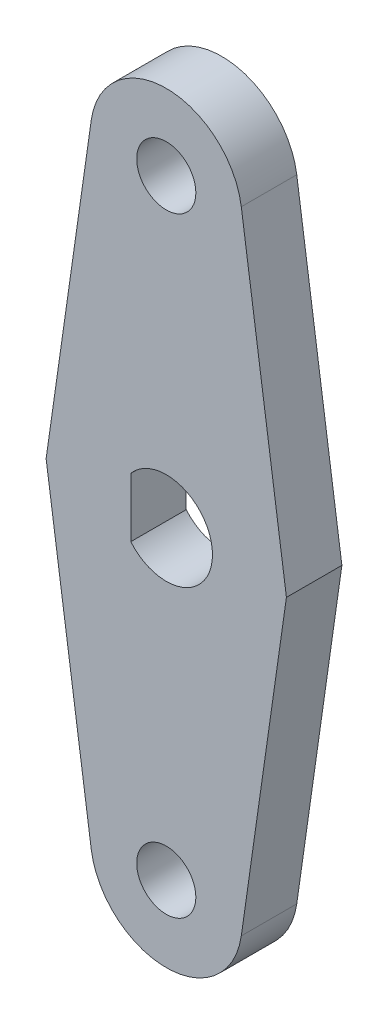
ISO-10303-21;
HEADER;
FILE_DESCRIPTION(('STEP AP214'),'2;1');
FILE_NAME('part.step','',(''),(''),'','','');
FILE_SCHEMA(('AUTOMOTIVE_DESIGN { 1 0 10303 214 1 1 1 1 }'));
ENDSEC;
DATA;
#1=APPLICATION_CONTEXT('core data for automotive mechanical design processes');
#2=APPLICATION_PROTOCOL_DEFINITION('international standard','automotive_design',2000,#1);
#3=PRODUCT_CONTEXT('',#1,'mechanical');
#4=PRODUCT('Part','Part','',(#3));
#5=PRODUCT_RELATED_PRODUCT_CATEGORY('part','',(#4));
#6=PRODUCT_DEFINITION_FORMATION('','',#4);
#7=PRODUCT_DEFINITION_CONTEXT('part definition',#1,'design');
#8=PRODUCT_DEFINITION('design','',#6,#7);
#9=PRODUCT_DEFINITION_SHAPE('','',#8);
#10=(LENGTH_UNIT() NAMED_UNIT(*) SI_UNIT(.MILLI.,.METRE.));
#11=(NAMED_UNIT(*) PLANE_ANGLE_UNIT() SI_UNIT($,.RADIAN.));
#12=(NAMED_UNIT(*) SI_UNIT($,.STERADIAN.) SOLID_ANGLE_UNIT());
#13=UNCERTAINTY_MEASURE_WITH_UNIT(LENGTH_MEASURE(1.E-05),#10,'distance_accuracy_value','');
#14=(GEOMETRIC_REPRESENTATION_CONTEXT(3) GLOBAL_UNCERTAINTY_ASSIGNED_CONTEXT((#13)) GLOBAL_UNIT_ASSIGNED_CONTEXT((#10,
#11,#12)) REPRESENTATION_CONTEXT('',''));
#15=CARTESIAN_POINT('',(0.,0.,0.));
#16=DIRECTION('',(0.,0.,1.));
#17=DIRECTION('',(1.,0.,0.));
#18=AXIS2_PLACEMENT_3D('',#15,#16,#17);
#19=CARTESIAN_POINT('',(0.,0.,3.));
#20=DIRECTION('',(0.,0.,-1.));
#21=DIRECTION('',(-1.,0.,0.));
#22=AXIS2_PLACEMENT_3D('',#19,#20,#21);
#23=CYLINDRICAL_SURFACE('',#22,2.5);
#24=CARTESIAN_POINT('',(0.,0.,0.));
#25=DIRECTION('',(0.,0.,1.));
#26=DIRECTION('',(1.,0.,0.));
#27=AXIS2_PLACEMENT_3D('',#24,#25,#26);
#28=CIRCLE('',#27,2.5);
#29=CARTESIAN_POINT('',(-1.92,-1.60112460477003,0.));
#30=VERTEX_POINT('',#29);
#31=CARTESIAN_POINT('',(-1.92,1.60112460477003,0.));
#32=VERTEX_POINT('',#31);
#33=EDGE_CURVE('E197',#30,#32,#28,.T.);
#34=ORIENTED_EDGE('',*,*,#33,.F.);
#35=DIRECTION('',(0.,0.,-1.));
#36=VECTOR('',#35,1.);
#37=CARTESIAN_POINT('',(-1.92,-1.60112460477003,3.));
#38=LINE('',#37,#36);
#39=CARTESIAN_POINT('',(-1.92,-1.60112460477003,3.));
#40=VERTEX_POINT('',#39);
#41=EDGE_CURVE('E11',#40,#30,#38,.T.);
#42=ORIENTED_EDGE('',*,*,#41,.F.);
#43=CARTESIAN_POINT('',(0.,0.,3.));
#44=DIRECTION('',(0.,0.,1.));
#45=DIRECTION('',(1.,0.,0.));
#46=AXIS2_PLACEMENT_3D('',#43,#44,#45);
#47=CIRCLE('',#46,2.5);
#48=CARTESIAN_POINT('',(-1.92,1.60112460477003,3.));
#49=VERTEX_POINT('',#48);
#50=EDGE_CURVE('E129',#40,#49,#47,.T.);
#51=ORIENTED_EDGE('',*,*,#50,.T.);
#52=DIRECTION('',(0.,0.,-1.));
#53=VECTOR('',#52,1.);
#54=CARTESIAN_POINT('',(-1.92,1.60112460477003,3.));
#55=LINE('',#54,#53);
#56=EDGE_CURVE('E59',#49,#32,#55,.T.);
#57=ORIENTED_EDGE('',*,*,#56,.T.);
#58=EDGE_LOOP('',(#34,#42,#51,#57));
#59=FACE_BOUND('',#58,.T.);
#60=ADVANCED_FACE('F50',(#59),#23,.F.);
#61=CARTESIAN_POINT('',(0.,-16.5,3.));
#62=DIRECTION('',(0.,0.,-1.));
#63=DIRECTION('',(-1.,0.,0.));
#64=AXIS2_PLACEMENT_3D('',#61,#62,#63);
#65=CYLINDRICAL_SURFACE('',#64,4.1);
#66=CARTESIAN_POINT('',(0.,-16.5,0.));
#67=DIRECTION('',(0.,0.,1.));
#68=DIRECTION('',(1.,0.,0.));
#69=AXIS2_PLACEMENT_3D('',#66,#67,#68);
#70=CIRCLE('',#69,4.1);
#71=CARTESIAN_POINT('',(-4.05875193670604,-17.0801143993084,0.));
#72=VERTEX_POINT('',#71);
#73=CARTESIAN_POINT('',(4.05875193670604,-17.0801143993084,0.));
#74=VERTEX_POINT('',#73);
#75=EDGE_CURVE('E176',#72,#74,#70,.T.);
#76=ORIENTED_EDGE('',*,*,#75,.T.);
#77=DIRECTION('',(0.,0.,-1.));
#78=VECTOR('',#77,1.);
#79=CARTESIAN_POINT('',(4.05875193670604,-17.0801143993084,3.));
#80=LINE('',#79,#78);
#81=CARTESIAN_POINT('',(4.05875193670604,-17.0801143993084,3.));
#82=VERTEX_POINT('',#81);
#83=EDGE_CURVE('E51',#82,#74,#80,.T.);
#84=ORIENTED_EDGE('',*,*,#83,.F.);
#85=CARTESIAN_POINT('',(0.,-16.5,3.));
#86=DIRECTION('',(0.,0.,1.));
#87=DIRECTION('',(1.,0.,0.));
#88=AXIS2_PLACEMENT_3D('',#85,#86,#87);
#89=CIRCLE('',#88,4.1);
#90=CARTESIAN_POINT('',(-4.05875193670604,-17.0801143993084,3.));
#91=VERTEX_POINT('',#90);
#92=EDGE_CURVE('E106',#91,#82,#89,.T.);
#93=ORIENTED_EDGE('',*,*,#92,.F.);
#94=DIRECTION('',(0.,0.,-1.));
#95=VECTOR('',#94,1.);
#96=CARTESIAN_POINT('',(-4.05875193670604,-17.0801143993084,3.));
#97=LINE('',#96,#95);
#98=EDGE_CURVE('E135',#91,#72,#97,.T.);
#99=ORIENTED_EDGE('',*,*,#98,.T.);
#100=EDGE_LOOP('',(#76,#84,#93,#99));
#101=FACE_BOUND('',#100,.T.);
#102=ADVANCED_FACE('F142',(#101),#65,.T.);
#103=CARTESIAN_POINT('',(6.3698713470641,-0.910440979838026,3.));
#104=DIRECTION('',(0.98993949675757,-0.141491316904497,0.));
#105=DIRECTION('',(0.141491316904497,0.98993949675757,0.));
#106=AXIS2_PLACEMENT_3D('',#103,#104,#105);
#107=PLANE('',#106);
#108=DIRECTION('',(-0.141491316904497,-0.98993949675757,0.));
#109=VECTOR('',#108,1.);
#110=CARTESIAN_POINT('',(6.3698713470641,-0.910440979838026,0.));
#111=LINE('',#110,#109);
#112=CARTESIAN_POINT('',(6.5,0.,0.));
#113=VERTEX_POINT('',#112);
#114=EDGE_CURVE('E177',#113,#74,#111,.T.);
#115=ORIENTED_EDGE('',*,*,#114,.F.);
#116=DIRECTION('',(0.,0.,-1.));
#117=VECTOR('',#116,1.);
#118=CARTESIAN_POINT('',(6.5,0.,3.));
#119=LINE('',#118,#117);
#120=CARTESIAN_POINT('',(6.5,0.,3.));
#121=VERTEX_POINT('',#120);
#122=EDGE_CURVE('E218',#121,#113,#119,.T.);
#123=ORIENTED_EDGE('',*,*,#122,.F.);
#124=DIRECTION('',(-0.141491316904497,-0.98993949675757,0.));
#125=VECTOR('',#124,1.);
#126=CARTESIAN_POINT('',(6.3698713470641,-0.910440979838026,3.));
#127=LINE('',#126,#125);
#128=EDGE_CURVE('E147',#121,#82,#127,.T.);
#129=ORIENTED_EDGE('',*,*,#128,.T.);
#130=ORIENTED_EDGE('',*,*,#83,.T.);
#131=EDGE_LOOP('',(#115,#123,#129,#130));
#132=FACE_BOUND('',#131,.T.);
#133=ADVANCED_FACE('F222',(#132),#107,.T.);
#134=CARTESIAN_POINT('',(6.3698713470641,0.910440979838026,3.));
#135=DIRECTION('',(-0.98993949675757,-0.141491316904497,0.));
#136=DIRECTION('',(0.141491316904497,-0.98993949675757,0.));
#137=AXIS2_PLACEMENT_3D('',#134,#135,#136);
#138=PLANE('',#137);
#139=DIRECTION('',(-0.141491316904497,0.98993949675757,0.));
#140=VECTOR('',#139,1.);
#141=CARTESIAN_POINT('',(6.3698713470641,0.910440979838026,0.));
#142=LINE('',#141,#140);
#143=CARTESIAN_POINT('',(4.05875193670604,17.0801143993084,0.));
#144=VERTEX_POINT('',#143);
#145=EDGE_CURVE('E183',#113,#144,#142,.T.);
#146=ORIENTED_EDGE('',*,*,#145,.T.);
#147=DIRECTION('',(0.,0.,-1.));
#148=VECTOR('',#147,1.);
#149=CARTESIAN_POINT('',(4.05875193670604,17.0801143993084,3.));
#150=LINE('',#149,#148);
#151=CARTESIAN_POINT('',(4.05875193670604,17.0801143993084,3.));
#152=VERTEX_POINT('',#151);
#153=EDGE_CURVE('E215',#152,#144,#150,.T.);
#154=ORIENTED_EDGE('',*,*,#153,.F.);
#155=DIRECTION('',(-0.141491316904497,0.98993949675757,0.));
#156=VECTOR('',#155,1.);
#157=CARTESIAN_POINT('',(6.3698713470641,0.910440979838026,3.));
#158=LINE('',#157,#156);
#159=EDGE_CURVE('E151',#121,#152,#158,.T.);
#160=ORIENTED_EDGE('',*,*,#159,.F.);
#161=ORIENTED_EDGE('',*,*,#122,.T.);
#162=EDGE_LOOP('',(#146,#154,#160,#161));
#163=FACE_BOUND('',#162,.T.);
#164=ADVANCED_FACE('F229',(#163),#138,.F.);
#165=CARTESIAN_POINT('',(0.,16.5,3.));
#166=DIRECTION('',(0.,0.,-1.));
#167=DIRECTION('',(-1.,0.,0.));
#168=AXIS2_PLACEMENT_3D('',#165,#166,#167);
#169=CYLINDRICAL_SURFACE('',#168,4.1);
#170=CARTESIAN_POINT('',(0.,16.5,0.));
#171=DIRECTION('',(0.,0.,1.));
#172=DIRECTION('',(1.,0.,0.));
#173=AXIS2_PLACEMENT_3D('',#170,#171,#172);
#174=CIRCLE('',#173,4.1);
#175=CARTESIAN_POINT('',(-4.05875193670604,17.0801143993084,0.));
#176=VERTEX_POINT('',#175);
#177=EDGE_CURVE('E190',#176,#144,#174,.F.);
#178=ORIENTED_EDGE('',*,*,#177,.F.);
#179=DIRECTION('',(0.,0.,-1.));
#180=VECTOR('',#179,1.);
#181=CARTESIAN_POINT('',(-4.05875193670604,17.0801143993084,3.));
#182=LINE('',#181,#180);
#183=CARTESIAN_POINT('',(-4.05875193670604,17.0801143993084,3.));
#184=VERTEX_POINT('',#183);
#185=EDGE_CURVE('E213',#184,#176,#182,.T.);
#186=ORIENTED_EDGE('',*,*,#185,.F.);
#187=CARTESIAN_POINT('',(0.,16.5,3.));
#188=DIRECTION('',(0.,0.,1.));
#189=DIRECTION('',(1.,0.,0.));
#190=AXIS2_PLACEMENT_3D('',#187,#188,#189);
#191=CIRCLE('',#190,4.1);
#192=EDGE_CURVE('E159',#184,#152,#191,.F.);
#193=ORIENTED_EDGE('',*,*,#192,.T.);
#194=ORIENTED_EDGE('',*,*,#153,.T.);
#195=EDGE_LOOP('',(#178,#186,#193,#194));
#196=FACE_BOUND('',#195,.T.);
#197=ADVANCED_FACE('F235',(#196),#169,.T.);
#198=CARTESIAN_POINT('',(-6.3698713470641,0.910440979838026,3.));
#199=DIRECTION('',(-0.98993949675757,0.141491316904497,0.));
#200=DIRECTION('',(-0.141491316904497,-0.98993949675757,0.));
#201=AXIS2_PLACEMENT_3D('',#198,#199,#200);
#202=PLANE('',#201);
#203=DIRECTION('',(0.141491316904497,0.98993949675757,0.));
#204=VECTOR('',#203,1.);
#205=CARTESIAN_POINT('',(-6.3698713470641,0.910440979838026,0.));
#206=LINE('',#205,#204);
#207=CARTESIAN_POINT('',(-6.5,0.,0.));
#208=VERTEX_POINT('',#207);
#209=EDGE_CURVE('E192',#208,#176,#206,.T.);
#210=ORIENTED_EDGE('',*,*,#209,.F.);
#211=DIRECTION('',(0.,0.,-1.));
#212=VECTOR('',#211,1.);
#213=CARTESIAN_POINT('',(-6.5,0.,3.));
#214=LINE('',#213,#212);
#215=CARTESIAN_POINT('',(-6.5,0.,3.));
#216=VERTEX_POINT('',#215);
#217=EDGE_CURVE('E139',#216,#208,#214,.T.);
#218=ORIENTED_EDGE('',*,*,#217,.F.);
#219=DIRECTION('',(0.141491316904497,0.98993949675757,0.));
#220=VECTOR('',#219,1.);
#221=CARTESIAN_POINT('',(-6.3698713470641,0.910440979838026,3.));
#222=LINE('',#221,#220);
#223=EDGE_CURVE('E128',#216,#184,#222,.T.);
#224=ORIENTED_EDGE('',*,*,#223,.T.);
#225=ORIENTED_EDGE('',*,*,#185,.T.);
#226=EDGE_LOOP('',(#210,#218,#224,#225));
#227=FACE_BOUND('',#226,.T.);
#228=ADVANCED_FACE('F234',(#227),#202,.T.);
#229=CARTESIAN_POINT('',(-1.92,0.,3.));
#230=DIRECTION('',(-1.,0.,0.));
#231=DIRECTION('',(0.,0.,1.));
#232=AXIS2_PLACEMENT_3D('',#229,#230,#231);
#233=PLANE('',#232);
#234=DIRECTION('',(0.,1.,0.));
#235=VECTOR('',#234,1.);
#236=CARTESIAN_POINT('',(-1.92,0.,0.));
#237=LINE('',#236,#235);
#238=EDGE_CURVE('E202',#30,#32,#237,.T.);
#239=ORIENTED_EDGE('',*,*,#238,.T.);
#240=ORIENTED_EDGE('',*,*,#56,.F.);
#241=DIRECTION('',(0.,1.,0.));
#242=VECTOR('',#241,1.);
#243=CARTESIAN_POINT('',(-1.92,0.,3.));
#244=LINE('',#243,#242);
#245=EDGE_CURVE('E67',#40,#49,#244,.T.);
#246=ORIENTED_EDGE('',*,*,#245,.F.);
#247=ORIENTED_EDGE('',*,*,#41,.T.);
#248=EDGE_LOOP('',(#239,#240,#246,#247));
#249=FACE_BOUND('',#248,.T.);
#250=ADVANCED_FACE('F240',(#249),#233,.F.);
#251=CARTESIAN_POINT('',(-6.3698713470641,-0.910440979838026,3.));
#252=DIRECTION('',(0.98993949675757,0.141491316904497,0.));
#253=DIRECTION('',(-0.141491316904497,0.98993949675757,0.));
#254=AXIS2_PLACEMENT_3D('',#251,#252,#253);
#255=PLANE('',#254);
#256=DIRECTION('',(0.141491316904497,-0.98993949675757,0.));
#257=VECTOR('',#256,1.);
#258=CARTESIAN_POINT('',(-6.3698713470641,-0.910440979838026,0.));
#259=LINE('',#258,#257);
#260=EDGE_CURVE('E134',#208,#72,#259,.T.);
#261=ORIENTED_EDGE('',*,*,#260,.T.);
#262=ORIENTED_EDGE('',*,*,#98,.F.);
#263=DIRECTION('',(0.141491316904497,-0.98993949675757,0.));
#264=VECTOR('',#263,1.);
#265=CARTESIAN_POINT('',(-6.3698713470641,-0.910440979838026,3.));
#266=LINE('',#265,#264);
#267=EDGE_CURVE('E123',#216,#91,#266,.T.);
#268=ORIENTED_EDGE('',*,*,#267,.F.);
#269=ORIENTED_EDGE('',*,*,#217,.T.);
#270=EDGE_LOOP('',(#261,#262,#268,#269));
#271=FACE_BOUND('',#270,.T.);
#272=ADVANCED_FACE('F133',(#271),#255,.F.);
#273=CARTESIAN_POINT('',(0.,-16.5,3.));
#274=DIRECTION('',(0.,0.,-1.));
#275=DIRECTION('',(-1.,0.,0.));
#276=AXIS2_PLACEMENT_3D('',#273,#274,#275);
#277=CYLINDRICAL_SURFACE('',#276,1.6);
#278=CARTESIAN_POINT('',(0.,-16.5,3.));
#279=DIRECTION('',(0.,0.,1.));
#280=DIRECTION('',(1.,0.,0.));
#281=AXIS2_PLACEMENT_3D('',#278,#279,#280);
#282=CIRCLE('',#281,1.6);
#283=CARTESIAN_POINT('',(1.6,-16.5,3.));
#284=VERTEX_POINT('',#283);
#285=EDGE_CURVE('E150',#284,#284,#282,.T.);
#286=ORIENTED_EDGE('',*,*,#285,.T.);
#287=EDGE_LOOP('',(#286));
#288=FACE_BOUND('',#287,.T.);
#289=CARTESIAN_POINT('',(0.,-16.5,0.));
#290=DIRECTION('',(0.,0.,1.));
#291=DIRECTION('',(1.,0.,0.));
#292=AXIS2_PLACEMENT_3D('',#289,#290,#291);
#293=CIRCLE('',#292,1.6);
#294=CARTESIAN_POINT('',(1.6,-16.5,0.));
#295=VERTEX_POINT('',#294);
#296=EDGE_CURVE('E175',#295,#295,#293,.T.);
#297=ORIENTED_EDGE('',*,*,#296,.F.);
#298=EDGE_LOOP('',(#297));
#299=FACE_BOUND('',#298,.T.);
#300=ADVANCED_FACE('F47',(#288,#299),#277,.F.);
#301=CARTESIAN_POINT('',(0.,16.5,3.));
#302=DIRECTION('',(0.,0.,-1.));
#303=DIRECTION('',(-1.,0.,0.));
#304=AXIS2_PLACEMENT_3D('',#301,#302,#303);
#305=CYLINDRICAL_SURFACE('',#304,1.6);
#306=CARTESIAN_POINT('',(0.,16.5,3.));
#307=DIRECTION('',(0.,0.,1.));
#308=DIRECTION('',(1.,0.,0.));
#309=AXIS2_PLACEMENT_3D('',#306,#307,#308);
#310=CIRCLE('',#309,1.6);
#311=CARTESIAN_POINT('',(1.6,16.5,3.));
#312=VERTEX_POINT('',#311);
#313=EDGE_CURVE('E141',#312,#312,#310,.F.);
#314=ORIENTED_EDGE('',*,*,#313,.F.);
#315=EDGE_LOOP('',(#314));
#316=FACE_BOUND('',#315,.T.);
#317=CARTESIAN_POINT('',(0.,16.5,0.));
#318=DIRECTION('',(0.,0.,1.));
#319=DIRECTION('',(1.,0.,0.));
#320=AXIS2_PLACEMENT_3D('',#317,#318,#319);
#321=CIRCLE('',#320,1.6);
#322=CARTESIAN_POINT('',(1.6,16.5,0.));
#323=VERTEX_POINT('',#322);
#324=EDGE_CURVE('E153',#323,#323,#321,.F.);
#325=ORIENTED_EDGE('',*,*,#324,.T.);
#326=EDGE_LOOP('',(#325));
#327=FACE_BOUND('',#326,.T.);
#328=ADVANCED_FACE('F258',(#316,#327),#305,.F.);
#329=CARTESIAN_POINT('',(0.,0.,3.));
#330=DIRECTION('',(0.,0.,1.));
#331=DIRECTION('',(1.,0.,0.));
#332=AXIS2_PLACEMENT_3D('',#329,#330,#331);
#333=PLANE('',#332);
#334=ORIENTED_EDGE('',*,*,#285,.F.);
#335=EDGE_LOOP('',(#334));
#336=FACE_BOUND('',#335,.T.);
#337=ORIENTED_EDGE('',*,*,#92,.T.);
#338=ORIENTED_EDGE('',*,*,#128,.F.);
#339=ORIENTED_EDGE('',*,*,#159,.T.);
#340=ORIENTED_EDGE('',*,*,#192,.F.);
#341=ORIENTED_EDGE('',*,*,#223,.F.);
#342=ORIENTED_EDGE('',*,*,#267,.T.);
#343=EDGE_LOOP('',(#337,#338,#339,#340,#341,#342));
#344=FACE_BOUND('',#343,.T.);
#345=ORIENTED_EDGE('',*,*,#50,.F.);
#346=ORIENTED_EDGE('',*,*,#245,.T.);
#347=EDGE_LOOP('',(#345,#346));
#348=FACE_BOUND('',#347,.T.);
#349=ORIENTED_EDGE('',*,*,#313,.T.);
#350=EDGE_LOOP('',(#349));
#351=FACE_BOUND('',#350,.T.);
#352=ADVANCED_FACE('F121',(#336,#344,#348,#351),#333,.T.);
#353=CARTESIAN_POINT('',(0.,0.,0.));
#354=DIRECTION('',(0.,0.,1.));
#355=DIRECTION('',(1.,0.,0.));
#356=AXIS2_PLACEMENT_3D('',#353,#354,#355);
#357=PLANE('',#356);
#358=ORIENTED_EDGE('',*,*,#296,.T.);
#359=EDGE_LOOP('',(#358));
#360=FACE_BOUND('',#359,.T.);
#361=ORIENTED_EDGE('',*,*,#75,.F.);
#362=ORIENTED_EDGE('',*,*,#260,.F.);
#363=ORIENTED_EDGE('',*,*,#209,.T.);
#364=ORIENTED_EDGE('',*,*,#177,.T.);
#365=ORIENTED_EDGE('',*,*,#145,.F.);
#366=ORIENTED_EDGE('',*,*,#114,.T.);
#367=EDGE_LOOP('',(#361,#362,#363,#364,#365,#366));
#368=FACE_BOUND('',#367,.T.);
#369=ORIENTED_EDGE('',*,*,#33,.T.);
#370=ORIENTED_EDGE('',*,*,#238,.F.);
#371=EDGE_LOOP('',(#369,#370));
#372=FACE_BOUND('',#371,.T.);
#373=ORIENTED_EDGE('',*,*,#324,.F.);
#374=EDGE_LOOP('',(#373));
#375=FACE_BOUND('',#374,.T.);
#376=ADVANCED_FACE('F226',(#360,#368,#372,#375),#357,.F.);
#377=CLOSED_SHELL('',(#60,#102,#133,#164,#197,#228,#250,#272,#300,#328,#352,#376));
#378=MANIFOLD_SOLID_BREP('B2',#377);
#379=ADVANCED_BREP_SHAPE_REPRESENTATION('',(#18,#378),#14);
#380=SHAPE_DEFINITION_REPRESENTATION(#9,#379);
ENDSEC;
END-ISO-10303-21;
